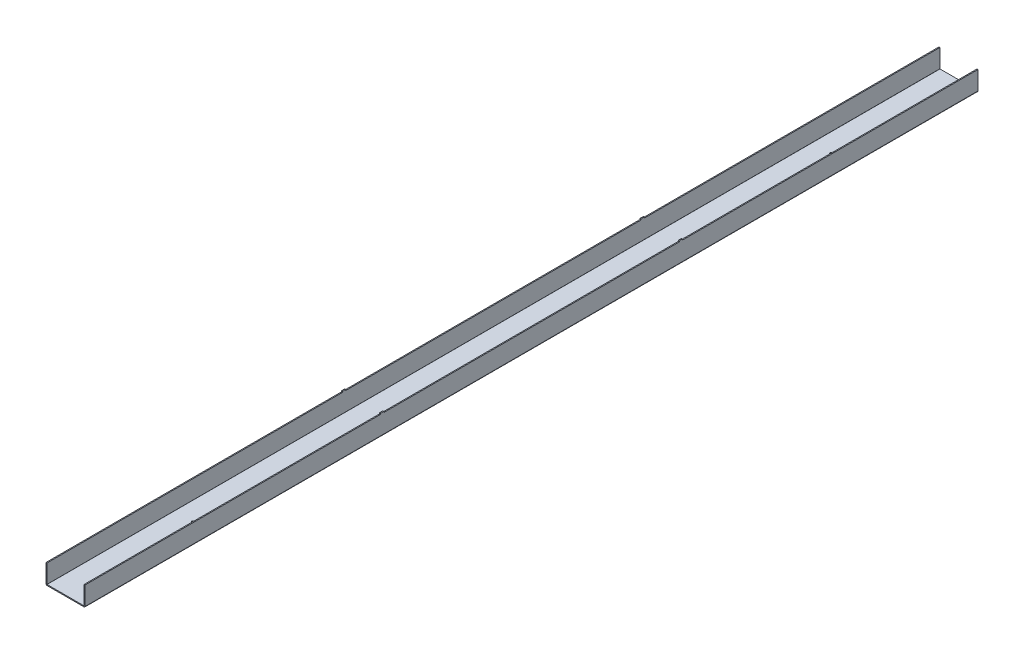
ISO-10303-21;
HEADER;
FILE_DESCRIPTION(('STEP AP214'),'2;1');
FILE_NAME('part.step','',(''),(''),'','','');
FILE_SCHEMA(('AUTOMOTIVE_DESIGN { 1 0 10303 214 1 1 1 1 }'));
ENDSEC;
DATA;
#1=APPLICATION_CONTEXT('core data for automotive mechanical design processes');
#2=APPLICATION_PROTOCOL_DEFINITION('international standard','automotive_design',2000,#1);
#3=PRODUCT_CONTEXT('',#1,'mechanical');
#4=PRODUCT('Part','Part','',(#3));
#5=PRODUCT_RELATED_PRODUCT_CATEGORY('part','',(#4));
#6=PRODUCT_DEFINITION_FORMATION('','',#4);
#7=PRODUCT_DEFINITION_CONTEXT('part definition',#1,'design');
#8=PRODUCT_DEFINITION('design','',#6,#7);
#9=PRODUCT_DEFINITION_SHAPE('','',#8);
#10=(LENGTH_UNIT() NAMED_UNIT(*) SI_UNIT(.MILLI.,.METRE.));
#11=(NAMED_UNIT(*) PLANE_ANGLE_UNIT() SI_UNIT($,.RADIAN.));
#12=(NAMED_UNIT(*) SI_UNIT($,.STERADIAN.) SOLID_ANGLE_UNIT());
#13=UNCERTAINTY_MEASURE_WITH_UNIT(LENGTH_MEASURE(1.E-05),#10,'distance_accuracy_value','');
#14=(GEOMETRIC_REPRESENTATION_CONTEXT(3) GLOBAL_UNCERTAINTY_ASSIGNED_CONTEXT((#13)) GLOBAL_UNIT_ASSIGNED_CONTEXT((#10,
#11,#12)) REPRESENTATION_CONTEXT('',''));
#15=CARTESIAN_POINT('',(0.,0.,0.));
#16=DIRECTION('',(0.,0.,1.));
#17=DIRECTION('',(1.,0.,0.));
#18=AXIS2_PLACEMENT_3D('',#15,#16,#17);
#19=CARTESIAN_POINT('',(2182.65200854939,1098.49999999999,-231.833333333333));
#20=DIRECTION('',(0.,0.,-1.));
#21=DIRECTION('',(0.,1.,0.));
#22=AXIS2_PLACEMENT_3D('',#19,#20,#21);
#23=PLANE('',#22);
#24=DIRECTION('',(0.,-1.,0.));
#25=VECTOR('',#24,1.);
#26=CARTESIAN_POINT('',(-560.,1098.5,-231.833333333333));
#27=LINE('',#26,#25);
#28=CARTESIAN_POINT('',(-560.,1100.,-231.833333333333));
#29=VERTEX_POINT('',#28);
#30=CARTESIAN_POINT('',(-560.,1098.5,-231.833333333333));
#31=VERTEX_POINT('',#30);
#32=EDGE_CURVE('E170',#29,#31,#27,.T.);
#33=ORIENTED_EDGE('',*,*,#32,.F.);
#34=DIRECTION('',(-1.,0.,0.));
#35=VECTOR('',#34,1.);
#36=CARTESIAN_POINT('',(2182.65200854939,1099.99999999999,-231.833333333333));
#37=LINE('',#36,#35);
#38=CARTESIAN_POINT('',(-558.5,1100.,-231.833333333333));
#39=VERTEX_POINT('',#38);
#40=EDGE_CURVE('E520',#39,#29,#37,.T.);
#41=ORIENTED_EDGE('',*,*,#40,.F.);
#42=DIRECTION('',(0.,-1.,0.));
#43=VECTOR('',#42,1.);
#44=CARTESIAN_POINT('',(-558.5,1098.5,-231.833333333333));
#45=LINE('',#44,#43);
#46=CARTESIAN_POINT('',(-558.5,1098.5,-231.833333333333));
#47=VERTEX_POINT('',#46);
#48=EDGE_CURVE('E530',#39,#47,#45,.T.);
#49=ORIENTED_EDGE('',*,*,#48,.T.);
#50=DIRECTION('',(-1.,0.,0.));
#51=VECTOR('',#50,1.);
#52=CARTESIAN_POINT('',(2182.65200854939,1098.49999999999,-231.833333333333));
#53=LINE('',#52,#51);
#54=EDGE_CURVE('E528',#47,#31,#53,.T.);
#55=ORIENTED_EDGE('',*,*,#54,.T.);
#56=EDGE_LOOP('',(#33,#41,#49,#55));
#57=FACE_BOUND('',#56,.T.);
#58=ADVANCED_FACE('F53',(#57),#23,.T.);
#59=CARTESIAN_POINT('',(2182.65200854939,1099.99999999999,-226.833333333333));
#60=DIRECTION('',(0.,1.,0.));
#61=DIRECTION('',(-1.,0.,0.));
#62=AXIS2_PLACEMENT_3D('',#59,#60,#61);
#63=PLANE('',#62);
#64=DIRECTION('',(0.,0.,-1.));
#65=VECTOR('',#64,1.);
#66=CARTESIAN_POINT('',(-560.,1100.,-226.833333333333));
#67=LINE('',#66,#65);
#68=CARTESIAN_POINT('',(-560.,1100.,-226.833333333333));
#69=VERTEX_POINT('',#68);
#70=EDGE_CURVE('E159',#69,#29,#67,.T.);
#71=ORIENTED_EDGE('',*,*,#70,.F.);
#72=DIRECTION('',(-1.,0.,0.));
#73=VECTOR('',#72,1.);
#74=CARTESIAN_POINT('',(2182.65200854939,1099.99999999999,-226.833333333333));
#75=LINE('',#74,#73);
#76=CARTESIAN_POINT('',(-558.5,1100.,-226.833333333333));
#77=VERTEX_POINT('',#76);
#78=EDGE_CURVE('E513',#77,#69,#75,.T.);
#79=ORIENTED_EDGE('',*,*,#78,.F.);
#80=DIRECTION('',(0.,0.,-1.));
#81=VECTOR('',#80,1.);
#82=CARTESIAN_POINT('',(-558.5,1100.,-226.833333333333));
#83=LINE('',#82,#81);
#84=EDGE_CURVE('E523',#77,#39,#83,.T.);
#85=ORIENTED_EDGE('',*,*,#84,.T.);
#86=ORIENTED_EDGE('',*,*,#40,.T.);
#87=EDGE_LOOP('',(#71,#79,#85,#86));
#88=FACE_BOUND('',#87,.T.);
#89=ADVANCED_FACE('F684',(#88),#63,.T.);
#90=CARTESIAN_POINT('',(2182.65200854939,1098.49999999999,-226.833333333333));
#91=DIRECTION('',(0.,0.,1.));
#92=DIRECTION('',(0.,-1.,0.));
#93=AXIS2_PLACEMENT_3D('',#90,#91,#92);
#94=PLANE('',#93);
#95=DIRECTION('',(0.,1.,0.));
#96=VECTOR('',#95,1.);
#97=CARTESIAN_POINT('',(-560.,1098.5,-226.833333333333));
#98=LINE('',#97,#96);
#99=CARTESIAN_POINT('',(-560.,1098.5,-226.833333333333));
#100=VERTEX_POINT('',#99);
#101=EDGE_CURVE('E616',#100,#69,#98,.T.);
#102=ORIENTED_EDGE('',*,*,#101,.F.);
#103=DIRECTION('',(-1.,0.,0.));
#104=VECTOR('',#103,1.);
#105=CARTESIAN_POINT('',(2182.65200854939,1098.49999999999,-226.833333333333));
#106=LINE('',#105,#104);
#107=CARTESIAN_POINT('',(-558.5,1098.5,-226.833333333333));
#108=VERTEX_POINT('',#107);
#109=EDGE_CURVE('E509',#108,#100,#106,.T.);
#110=ORIENTED_EDGE('',*,*,#109,.F.);
#111=DIRECTION('',(0.,1.,0.));
#112=VECTOR('',#111,1.);
#113=CARTESIAN_POINT('',(-558.5,1098.5,-226.833333333333));
#114=LINE('',#113,#112);
#115=EDGE_CURVE('E515',#108,#77,#114,.T.);
#116=ORIENTED_EDGE('',*,*,#115,.T.);
#117=ORIENTED_EDGE('',*,*,#78,.T.);
#118=EDGE_LOOP('',(#102,#110,#116,#117));
#119=FACE_BOUND('',#118,.T.);
#120=ADVANCED_FACE('F683',(#119),#94,.T.);
#121=CARTESIAN_POINT('',(2182.65200854939,1098.49999999999,685.5));
#122=DIRECTION('',(0.,-1.,0.));
#123=DIRECTION('',(1.,0.,0.));
#124=AXIS2_PLACEMENT_3D('',#121,#122,#123);
#125=PLANE('',#124);
#126=ORIENTED_EDGE('',*,*,#109,.T.);
#127=DIRECTION('',(0.,0.,1.));
#128=VECTOR('',#127,1.);
#129=CARTESIAN_POINT('',(-560.,1098.5,685.5));
#130=LINE('',#129,#128);
#131=CARTESIAN_POINT('',(-560.,1098.5,226.833333333333));
#132=VERTEX_POINT('',#131);
#133=EDGE_CURVE('E389',#100,#132,#130,.T.);
#134=ORIENTED_EDGE('',*,*,#133,.T.);
#135=DIRECTION('',(-1.,0.,0.));
#136=VECTOR('',#135,1.);
#137=CARTESIAN_POINT('',(2182.65200854939,1098.49999999999,226.833333333333));
#138=LINE('',#137,#136);
#139=CARTESIAN_POINT('',(-558.5,1098.5,226.833333333333));
#140=VERTEX_POINT('',#139);
#141=EDGE_CURVE('E508',#140,#132,#138,.T.);
#142=ORIENTED_EDGE('',*,*,#141,.F.);
#143=DIRECTION('',(0.,0.,1.));
#144=VECTOR('',#143,1.);
#145=CARTESIAN_POINT('',(-558.5,1098.5,685.5));
#146=LINE('',#145,#144);
#147=EDGE_CURVE('E66',#108,#140,#146,.T.);
#148=ORIENTED_EDGE('',*,*,#147,.F.);
#149=EDGE_LOOP('',(#126,#134,#142,#148));
#150=FACE_BOUND('',#149,.T.);
#151=ADVANCED_FACE('F671',(#150),#125,.F.);
#152=CARTESIAN_POINT('',(2182.65200854939,1098.49999999999,226.833333333333));
#153=DIRECTION('',(0.,0.,-1.));
#154=DIRECTION('',(0.,1.,0.));
#155=AXIS2_PLACEMENT_3D('',#152,#153,#154);
#156=PLANE('',#155);
#157=DIRECTION('',(0.,-1.,0.));
#158=VECTOR('',#157,1.);
#159=CARTESIAN_POINT('',(-560.,1098.5,226.833333333333));
#160=LINE('',#159,#158);
#161=CARTESIAN_POINT('',(-560.,1100.,226.833333333333));
#162=VERTEX_POINT('',#161);
#163=EDGE_CURVE('E620',#162,#132,#160,.T.);
#164=ORIENTED_EDGE('',*,*,#163,.F.);
#165=DIRECTION('',(-1.,0.,0.));
#166=VECTOR('',#165,1.);
#167=CARTESIAN_POINT('',(2182.65200854939,1099.99999999999,226.833333333333));
#168=LINE('',#167,#166);
#169=CARTESIAN_POINT('',(-558.5,1100.,226.833333333333));
#170=VERTEX_POINT('',#169);
#171=EDGE_CURVE('E637',#170,#162,#168,.T.);
#172=ORIENTED_EDGE('',*,*,#171,.F.);
#173=DIRECTION('',(0.,-1.,0.));
#174=VECTOR('',#173,1.);
#175=CARTESIAN_POINT('',(-558.5,1098.5,226.833333333333));
#176=LINE('',#175,#174);
#177=EDGE_CURVE('E502',#170,#140,#176,.T.);
#178=ORIENTED_EDGE('',*,*,#177,.T.);
#179=ORIENTED_EDGE('',*,*,#141,.T.);
#180=EDGE_LOOP('',(#164,#172,#178,#179));
#181=FACE_BOUND('',#180,.T.);
#182=ADVANCED_FACE('F675',(#181),#156,.T.);
#183=CARTESIAN_POINT('',(2182.65200854939,1099.99999999999,231.833333333333));
#184=DIRECTION('',(0.,1.,0.));
#185=DIRECTION('',(-1.,0.,0.));
#186=AXIS2_PLACEMENT_3D('',#183,#184,#185);
#187=PLANE('',#186);
#188=DIRECTION('',(0.,0.,-1.));
#189=VECTOR('',#188,1.);
#190=CARTESIAN_POINT('',(-560.,1100.,231.833333333333));
#191=LINE('',#190,#189);
#192=CARTESIAN_POINT('',(-560.,1100.,231.833333333333));
#193=VERTEX_POINT('',#192);
#194=EDGE_CURVE('E407',#193,#162,#191,.T.);
#195=ORIENTED_EDGE('',*,*,#194,.F.);
#196=DIRECTION('',(-1.,0.,0.));
#197=VECTOR('',#196,1.);
#198=CARTESIAN_POINT('',(2182.65200854939,1099.99999999999,231.833333333333));
#199=LINE('',#198,#197);
#200=CARTESIAN_POINT('',(-558.5,1100.,231.833333333333));
#201=VERTEX_POINT('',#200);
#202=EDGE_CURVE('E635',#201,#193,#199,.T.);
#203=ORIENTED_EDGE('',*,*,#202,.F.);
#204=DIRECTION('',(0.,0.,-1.));
#205=VECTOR('',#204,1.);
#206=CARTESIAN_POINT('',(-558.5,1100.,231.833333333333));
#207=LINE('',#206,#205);
#208=EDGE_CURVE('E677',#201,#170,#207,.T.);
#209=ORIENTED_EDGE('',*,*,#208,.T.);
#210=ORIENTED_EDGE('',*,*,#171,.T.);
#211=EDGE_LOOP('',(#195,#203,#209,#210));
#212=FACE_BOUND('',#211,.T.);
#213=ADVANCED_FACE('F633',(#212),#187,.T.);
#214=CARTESIAN_POINT('',(2182.65200854939,1098.49999999999,231.833333333333));
#215=DIRECTION('',(0.,0.,1.));
#216=DIRECTION('',(0.,-1.,0.));
#217=AXIS2_PLACEMENT_3D('',#214,#215,#216);
#218=PLANE('',#217);
#219=DIRECTION('',(0.,1.,0.));
#220=VECTOR('',#219,1.);
#221=CARTESIAN_POINT('',(-560.,1098.5,231.833333333333));
#222=LINE('',#221,#220);
#223=CARTESIAN_POINT('',(-560.,1098.5,231.833333333333));
#224=VERTEX_POINT('',#223);
#225=EDGE_CURVE('E355',#224,#193,#222,.T.);
#226=ORIENTED_EDGE('',*,*,#225,.F.);
#227=DIRECTION('',(-1.,0.,0.));
#228=VECTOR('',#227,1.);
#229=CARTESIAN_POINT('',(2182.65200854939,1098.49999999999,231.833333333333));
#230=LINE('',#229,#228);
#231=CARTESIAN_POINT('',(-558.5,1098.5,231.833333333333));
#232=VERTEX_POINT('',#231);
#233=EDGE_CURVE('E645',#232,#224,#230,.T.);
#234=ORIENTED_EDGE('',*,*,#233,.F.);
#235=DIRECTION('',(0.,1.,0.));
#236=VECTOR('',#235,1.);
#237=CARTESIAN_POINT('',(-558.5,1098.5,231.833333333333));
#238=LINE('',#237,#236);
#239=EDGE_CURVE('E643',#232,#201,#238,.T.);
#240=ORIENTED_EDGE('',*,*,#239,.T.);
#241=ORIENTED_EDGE('',*,*,#202,.T.);
#242=EDGE_LOOP('',(#226,#234,#240,#241));
#243=FACE_BOUND('',#242,.T.);
#244=ADVANCED_FACE('F640',(#243),#218,.T.);
#245=ORIENTED_EDGE('',*,*,#233,.T.);
#246=CARTESIAN_POINT('',(-560.,1098.5,685.5));
#247=VERTEX_POINT('',#246);
#248=EDGE_CURVE('E390',#224,#247,#130,.T.);
#249=ORIENTED_EDGE('',*,*,#248,.T.);
#250=DIRECTION('',(-1.,0.,0.));
#251=VECTOR('',#250,1.);
#252=CARTESIAN_POINT('',(2182.65200854939,1098.49999999999,685.5));
#253=LINE('',#252,#251);
#254=CARTESIAN_POINT('',(-558.5,1098.5,685.5));
#255=VERTEX_POINT('',#254);
#256=EDGE_CURVE('E487',#255,#247,#253,.T.);
#257=ORIENTED_EDGE('',*,*,#256,.F.);
#258=EDGE_CURVE('E12',#232,#255,#146,.T.);
#259=ORIENTED_EDGE('',*,*,#258,.F.);
#260=EDGE_LOOP('',(#245,#249,#257,#259));
#261=FACE_BOUND('',#260,.T.);
#262=ADVANCED_FACE('F690',(#261),#125,.F.);
#263=DIRECTION('',(-1.,0.,0.));
#264=VECTOR('',#263,1.);
#265=CARTESIAN_POINT('',(2182.65200854939,1098.49999999999,-685.5));
#266=LINE('',#265,#264);
#267=CARTESIAN_POINT('',(-558.5,1098.5,-685.5));
#268=VERTEX_POINT('',#267);
#269=CARTESIAN_POINT('',(-560.,1098.5,-685.5));
#270=VERTEX_POINT('',#269);
#271=EDGE_CURVE('E387',#268,#270,#266,.T.);
#272=ORIENTED_EDGE('',*,*,#271,.T.);
#273=EDGE_CURVE('E378',#270,#31,#130,.T.);
#274=ORIENTED_EDGE('',*,*,#273,.T.);
#275=ORIENTED_EDGE('',*,*,#54,.F.);
#276=EDGE_CURVE('E68',#268,#47,#146,.T.);
#277=ORIENTED_EDGE('',*,*,#276,.F.);
#278=EDGE_LOOP('',(#272,#274,#275,#277));
#279=FACE_BOUND('',#278,.T.);
#280=ADVANCED_FACE('F688',(#279),#125,.F.);
#281=CARTESIAN_POINT('',(2182.65200854939,1070.73659999999,-685.5));
#282=DIRECTION('',(0.,0.,-1.));
#283=DIRECTION('',(0.,1.,0.));
#284=AXIS2_PLACEMENT_3D('',#281,#282,#283);
#285=PLANE('',#284);
#286=DIRECTION('',(0.,1.,0.));
#287=VECTOR('',#286,1.);
#288=CARTESIAN_POINT('',(-560.,1070.7366,-685.5));
#289=LINE('',#288,#287);
#290=CARTESIAN_POINT('',(-560.,1070.1,-685.5));
#291=VERTEX_POINT('',#290);
#292=EDGE_CURVE('E370',#291,#270,#289,.T.);
#293=ORIENTED_EDGE('',*,*,#292,.T.);
#294=ORIENTED_EDGE('',*,*,#271,.F.);
#295=DIRECTION('',(0.,1.,0.));
#296=VECTOR('',#295,1.);
#297=CARTESIAN_POINT('',(-558.5,1070.7366,-685.5));
#298=LINE('',#297,#296);
#299=CARTESIAN_POINT('',(-558.5,1070.1,-685.5));
#300=VERTEX_POINT('',#299);
#301=EDGE_CURVE('E372',#268,#300,#298,.F.);
#302=ORIENTED_EDGE('',*,*,#301,.T.);
#303=DIRECTION('',(-1.,0.,0.));
#304=VECTOR('',#303,1.);
#305=CARTESIAN_POINT('',(2182.65200854939,1070.09999999999,-685.5));
#306=LINE('',#305,#304);
#307=EDGE_CURVE('E356',#300,#291,#306,.T.);
#308=ORIENTED_EDGE('',*,*,#307,.T.);
#309=EDGE_LOOP('',(#293,#294,#302,#308));
#310=FACE_BOUND('',#309,.T.);
#311=ADVANCED_FACE('F368',(#310),#285,.T.);
#312=CARTESIAN_POINT('',(-560.,1098.5,685.5));
#313=DIRECTION('',(1.,0.,0.));
#314=DIRECTION('',(0.,1.,0.));
#315=AXIS2_PLACEMENT_3D('',#312,#313,#314);
#316=PLANE('',#315);
#317=ORIENTED_EDGE('',*,*,#292,.F.);
#318=DIRECTION('',(0.,0.,1.));
#319=VECTOR('',#318,1.);
#320=CARTESIAN_POINT('',(-560.,1070.1,-685.5));
#321=LINE('',#320,#319);
#322=CARTESIAN_POINT('',(-560.,1070.1,685.5));
#323=VERTEX_POINT('',#322);
#324=EDGE_CURVE('E342',#291,#323,#321,.T.);
#325=ORIENTED_EDGE('',*,*,#324,.T.);
#326=DIRECTION('',(0.,1.,0.));
#327=VECTOR('',#326,1.);
#328=CARTESIAN_POINT('',(-560.,1070.7366,685.5));
#329=LINE('',#328,#327);
#330=EDGE_CURVE('E612',#247,#323,#329,.F.);
#331=ORIENTED_EDGE('',*,*,#330,.F.);
#332=ORIENTED_EDGE('',*,*,#248,.F.);
#333=ORIENTED_EDGE('',*,*,#225,.T.);
#334=ORIENTED_EDGE('',*,*,#194,.T.);
#335=ORIENTED_EDGE('',*,*,#163,.T.);
#336=ORIENTED_EDGE('',*,*,#133,.F.);
#337=ORIENTED_EDGE('',*,*,#101,.T.);
#338=ORIENTED_EDGE('',*,*,#70,.T.);
#339=ORIENTED_EDGE('',*,*,#32,.T.);
#340=ORIENTED_EDGE('',*,*,#273,.F.);
#341=EDGE_LOOP('',(#317,#325,#331,#332,#333,#334,#335,#336,#337,#338,#339,#340));
#342=FACE_BOUND('',#341,.T.);
#343=ADVANCED_FACE('F377',(#342),#316,.F.);
#344=CARTESIAN_POINT('',(2182.65200854939,1070.73659999999,685.5));
#345=DIRECTION('',(0.,0.,1.));
#346=DIRECTION('',(0.,-1.,0.));
#347=AXIS2_PLACEMENT_3D('',#344,#345,#346);
#348=PLANE('',#347);
#349=ORIENTED_EDGE('',*,*,#330,.T.);
#350=DIRECTION('',(-1.,0.,0.));
#351=VECTOR('',#350,1.);
#352=CARTESIAN_POINT('',(2182.65200854939,1070.09999999999,685.5));
#353=LINE('',#352,#351);
#354=CARTESIAN_POINT('',(-558.5,1070.1,685.5));
#355=VERTEX_POINT('',#354);
#356=EDGE_CURVE('E534',#355,#323,#353,.T.);
#357=ORIENTED_EDGE('',*,*,#356,.F.);
#358=DIRECTION('',(0.,1.,0.));
#359=VECTOR('',#358,1.);
#360=CARTESIAN_POINT('',(-558.5,1070.7366,685.5));
#361=LINE('',#360,#359);
#362=EDGE_CURVE('E655',#355,#255,#361,.T.);
#363=ORIENTED_EDGE('',*,*,#362,.T.);
#364=ORIENTED_EDGE('',*,*,#256,.T.);
#365=EDGE_LOOP('',(#349,#357,#363,#364));
#366=FACE_BOUND('',#365,.T.);
#367=ADVANCED_FACE('F662',(#366),#348,.T.);
#368=CARTESIAN_POINT('',(-558.5,1098.5,685.5));
#369=DIRECTION('',(1.,0.,0.));
#370=DIRECTION('',(0.,1.,0.));
#371=AXIS2_PLACEMENT_3D('',#368,#369,#370);
#372=PLANE('',#371);
#373=DIRECTION('',(0.,0.,1.));
#374=VECTOR('',#373,1.);
#375=CARTESIAN_POINT('',(-558.5,1070.1,-685.5));
#376=LINE('',#375,#374);
#377=EDGE_CURVE('E58',#300,#355,#376,.T.);
#378=ORIENTED_EDGE('',*,*,#377,.F.);
#379=ORIENTED_EDGE('',*,*,#301,.F.);
#380=ORIENTED_EDGE('',*,*,#276,.T.);
#381=ORIENTED_EDGE('',*,*,#48,.F.);
#382=ORIENTED_EDGE('',*,*,#84,.F.);
#383=ORIENTED_EDGE('',*,*,#115,.F.);
#384=ORIENTED_EDGE('',*,*,#147,.T.);
#385=ORIENTED_EDGE('',*,*,#177,.F.);
#386=ORIENTED_EDGE('',*,*,#208,.F.);
#387=ORIENTED_EDGE('',*,*,#239,.F.);
#388=ORIENTED_EDGE('',*,*,#258,.T.);
#389=ORIENTED_EDGE('',*,*,#362,.F.);
#390=EDGE_LOOP('',(#378,#379,#380,#381,#382,#383,#384,#385,#386,#387,#388,#389));
#391=FACE_BOUND('',#390,.T.);
#392=ADVANCED_FACE('F56',(#391),#372,.T.);
#393=CARTESIAN_POINT('',(-3242.65200854939,1098.5,231.833333333333));
#394=DIRECTION('',(0.,0.,1.));
#395=DIRECTION('',(0.,1.,0.));
#396=AXIS2_PLACEMENT_3D('',#393,#394,#395);
#397=PLANE('',#396);
#398=DIRECTION('',(0.,-1.,0.));
#399=VECTOR('',#398,1.);
#400=CARTESIAN_POINT('',(-500.,1098.5,231.833333333333));
#401=LINE('',#400,#399);
#402=CARTESIAN_POINT('',(-500.,1100.,231.833333333333));
#403=VERTEX_POINT('',#402);
#404=CARTESIAN_POINT('',(-500.,1098.5,231.833333333333));
#405=VERTEX_POINT('',#404);
#406=EDGE_CURVE('E271',#403,#405,#401,.T.);
#407=ORIENTED_EDGE('',*,*,#406,.F.);
#408=DIRECTION('',(1.,0.,0.));
#409=VECTOR('',#408,1.);
#410=CARTESIAN_POINT('',(-3242.65200854939,1100.,231.833333333333));
#411=LINE('',#410,#409);
#412=CARTESIAN_POINT('',(-501.5,1100.,231.833333333333));
#413=VERTEX_POINT('',#412);
#414=EDGE_CURVE('E588',#413,#403,#411,.T.);
#415=ORIENTED_EDGE('',*,*,#414,.F.);
#416=DIRECTION('',(0.,-1.,0.));
#417=VECTOR('',#416,1.);
#418=CARTESIAN_POINT('',(-501.5,1098.5,231.833333333333));
#419=LINE('',#418,#417);
#420=CARTESIAN_POINT('',(-501.5,1098.5,231.833333333333));
#421=VERTEX_POINT('',#420);
#422=EDGE_CURVE('E598',#413,#421,#419,.T.);
#423=ORIENTED_EDGE('',*,*,#422,.T.);
#424=DIRECTION('',(1.,0.,0.));
#425=VECTOR('',#424,1.);
#426=CARTESIAN_POINT('',(-3242.65200854939,1098.5,231.833333333333));
#427=LINE('',#426,#425);
#428=EDGE_CURVE('E595',#421,#405,#427,.T.);
#429=ORIENTED_EDGE('',*,*,#428,.T.);
#430=EDGE_LOOP('',(#407,#415,#423,#429));
#431=FACE_BOUND('',#430,.T.);
#432=ADVANCED_FACE('F776',(#431),#397,.T.);
#433=CARTESIAN_POINT('',(-3242.65200854939,1100.,226.833333333333));
#434=DIRECTION('',(0.,1.,0.));
#435=DIRECTION('',(-1.,0.,0.));
#436=AXIS2_PLACEMENT_3D('',#433,#434,#435);
#437=PLANE('',#436);
#438=DIRECTION('',(0.,0.,1.));
#439=VECTOR('',#438,1.);
#440=CARTESIAN_POINT('',(-500.,1100.,226.833333333333));
#441=LINE('',#440,#439);
#442=CARTESIAN_POINT('',(-500.,1100.,226.833333333333));
#443=VERTEX_POINT('',#442);
#444=EDGE_CURVE('E263',#443,#403,#441,.T.);
#445=ORIENTED_EDGE('',*,*,#444,.F.);
#446=DIRECTION('',(1.,0.,0.));
#447=VECTOR('',#446,1.);
#448=CARTESIAN_POINT('',(-3242.65200854939,1100.,226.833333333333));
#449=LINE('',#448,#447);
#450=CARTESIAN_POINT('',(-501.5,1100.,226.833333333333));
#451=VERTEX_POINT('',#450);
#452=EDGE_CURVE('E587',#451,#443,#449,.T.);
#453=ORIENTED_EDGE('',*,*,#452,.F.);
#454=DIRECTION('',(0.,0.,1.));
#455=VECTOR('',#454,1.);
#456=CARTESIAN_POINT('',(-501.5,1100.,226.833333333333));
#457=LINE('',#456,#455);
#458=EDGE_CURVE('E590',#451,#413,#457,.T.);
#459=ORIENTED_EDGE('',*,*,#458,.T.);
#460=ORIENTED_EDGE('',*,*,#414,.T.);
#461=EDGE_LOOP('',(#445,#453,#459,#460));
#462=FACE_BOUND('',#461,.T.);
#463=ADVANCED_FACE('F784',(#462),#437,.T.);
#464=CARTESIAN_POINT('',(-3242.65200854939,1098.5,226.833333333333));
#465=DIRECTION('',(0.,0.,-1.));
#466=DIRECTION('',(0.,-1.,0.));
#467=AXIS2_PLACEMENT_3D('',#464,#465,#466);
#468=PLANE('',#467);
#469=DIRECTION('',(0.,1.,0.));
#470=VECTOR('',#469,1.);
#471=CARTESIAN_POINT('',(-500.,1098.5,226.833333333333));
#472=LINE('',#471,#470);
#473=CARTESIAN_POINT('',(-500.,1098.5,226.833333333333));
#474=VERTEX_POINT('',#473);
#475=EDGE_CURVE('E1235',#474,#443,#472,.T.);
#476=ORIENTED_EDGE('',*,*,#475,.F.);
#477=DIRECTION('',(1.,0.,0.));
#478=VECTOR('',#477,1.);
#479=CARTESIAN_POINT('',(-3242.65200854939,1098.5,226.833333333333));
#480=LINE('',#479,#478);
#481=CARTESIAN_POINT('',(-501.5,1098.5,226.833333333333));
#482=VERTEX_POINT('',#481);
#483=EDGE_CURVE('E576',#482,#474,#480,.T.);
#484=ORIENTED_EDGE('',*,*,#483,.F.);
#485=DIRECTION('',(0.,1.,0.));
#486=VECTOR('',#485,1.);
#487=CARTESIAN_POINT('',(-501.5,1098.5,226.833333333333));
#488=LINE('',#487,#486);
#489=EDGE_CURVE('E549',#482,#451,#488,.T.);
#490=ORIENTED_EDGE('',*,*,#489,.T.);
#491=ORIENTED_EDGE('',*,*,#452,.T.);
#492=EDGE_LOOP('',(#476,#484,#490,#491));
#493=FACE_BOUND('',#492,.T.);
#494=ADVANCED_FACE('F793',(#493),#468,.T.);
#495=CARTESIAN_POINT('',(-3242.65200854939,1098.5,685.5));
#496=DIRECTION('',(0.,-1.,0.));
#497=DIRECTION('',(1.,0.,0.));
#498=AXIS2_PLACEMENT_3D('',#495,#496,#497);
#499=PLANE('',#498);
#500=ORIENTED_EDGE('',*,*,#483,.T.);
#501=DIRECTION('',(0.,0.,1.));
#502=VECTOR('',#501,1.);
#503=CARTESIAN_POINT('',(-500.,1098.5,685.5));
#504=LINE('',#503,#502);
#505=CARTESIAN_POINT('',(-500.,1098.5,-226.833333333333));
#506=VERTEX_POINT('',#505);
#507=EDGE_CURVE('E563',#474,#506,#504,.F.);
#508=ORIENTED_EDGE('',*,*,#507,.T.);
#509=DIRECTION('',(1.,0.,0.));
#510=VECTOR('',#509,1.);
#511=CARTESIAN_POINT('',(-3242.65200854939,1098.5,-226.833333333333));
#512=LINE('',#511,#510);
#513=CARTESIAN_POINT('',(-501.5,1098.5,-226.833333333333));
#514=VERTEX_POINT('',#513);
#515=EDGE_CURVE('E558',#514,#506,#512,.T.);
#516=ORIENTED_EDGE('',*,*,#515,.F.);
#517=DIRECTION('',(0.,0.,1.));
#518=VECTOR('',#517,1.);
#519=CARTESIAN_POINT('',(-501.5,1098.5,685.5));
#520=LINE('',#519,#518);
#521=EDGE_CURVE('E467',#482,#514,#520,.F.);
#522=ORIENTED_EDGE('',*,*,#521,.F.);
#523=EDGE_LOOP('',(#500,#508,#516,#522));
#524=FACE_BOUND('',#523,.T.);
#525=ADVANCED_FACE('F565',(#524),#499,.F.);
#526=CARTESIAN_POINT('',(-3242.65200854939,1098.5,-226.833333333333));
#527=DIRECTION('',(0.,0.,1.));
#528=DIRECTION('',(0.,1.,0.));
#529=AXIS2_PLACEMENT_3D('',#526,#527,#528);
#530=PLANE('',#529);
#531=DIRECTION('',(0.,-1.,0.));
#532=VECTOR('',#531,1.);
#533=CARTESIAN_POINT('',(-500.,1098.5,-226.833333333333));
#534=LINE('',#533,#532);
#535=CARTESIAN_POINT('',(-500.,1100.,-226.833333333333));
#536=VERTEX_POINT('',#535);
#537=EDGE_CURVE('E1230',#536,#506,#534,.T.);
#538=ORIENTED_EDGE('',*,*,#537,.F.);
#539=DIRECTION('',(1.,0.,0.));
#540=VECTOR('',#539,1.);
#541=CARTESIAN_POINT('',(-3242.65200854939,1100.,-226.833333333333));
#542=LINE('',#541,#540);
#543=CARTESIAN_POINT('',(-501.5,1100.,-226.833333333333));
#544=VERTEX_POINT('',#543);
#545=EDGE_CURVE('E561',#544,#536,#542,.T.);
#546=ORIENTED_EDGE('',*,*,#545,.F.);
#547=DIRECTION('',(0.,-1.,0.));
#548=VECTOR('',#547,1.);
#549=CARTESIAN_POINT('',(-501.5,1098.5,-226.833333333333));
#550=LINE('',#549,#548);
#551=EDGE_CURVE('E546',#544,#514,#550,.T.);
#552=ORIENTED_EDGE('',*,*,#551,.T.);
#553=ORIENTED_EDGE('',*,*,#515,.T.);
#554=EDGE_LOOP('',(#538,#546,#552,#553));
#555=FACE_BOUND('',#554,.T.);
#556=ADVANCED_FACE('F557',(#555),#530,.T.);
#557=CARTESIAN_POINT('',(-3242.65200854939,1100.,-231.833333333333));
#558=DIRECTION('',(0.,1.,0.));
#559=DIRECTION('',(-1.,0.,0.));
#560=AXIS2_PLACEMENT_3D('',#557,#558,#559);
#561=PLANE('',#560);
#562=DIRECTION('',(0.,0.,1.));
#563=VECTOR('',#562,1.);
#564=CARTESIAN_POINT('',(-500.,1100.,-231.833333333333));
#565=LINE('',#564,#563);
#566=CARTESIAN_POINT('',(-500.,1100.,-231.833333333333));
#567=VERTEX_POINT('',#566);
#568=EDGE_CURVE('E1226',#567,#536,#565,.T.);
#569=ORIENTED_EDGE('',*,*,#568,.F.);
#570=DIRECTION('',(1.,0.,0.));
#571=VECTOR('',#570,1.);
#572=CARTESIAN_POINT('',(-3242.65200854939,1100.,-231.833333333333));
#573=LINE('',#572,#571);
#574=CARTESIAN_POINT('',(-501.5,1100.,-231.833333333333));
#575=VERTEX_POINT('',#574);
#576=EDGE_CURVE('E1216',#575,#567,#573,.T.);
#577=ORIENTED_EDGE('',*,*,#576,.F.);
#578=DIRECTION('',(0.,0.,1.));
#579=VECTOR('',#578,1.);
#580=CARTESIAN_POINT('',(-501.5,1100.,-231.833333333333));
#581=LINE('',#580,#579);
#582=EDGE_CURVE('E568',#575,#544,#581,.T.);
#583=ORIENTED_EDGE('',*,*,#582,.T.);
#584=ORIENTED_EDGE('',*,*,#545,.T.);
#585=EDGE_LOOP('',(#569,#577,#583,#584));
#586=FACE_BOUND('',#585,.T.);
#587=ADVANCED_FACE('F821',(#586),#561,.T.);
#588=CARTESIAN_POINT('',(-3242.65200854939,1098.5,-231.833333333333));
#589=DIRECTION('',(0.,0.,-1.));
#590=DIRECTION('',(0.,-1.,0.));
#591=AXIS2_PLACEMENT_3D('',#588,#589,#590);
#592=PLANE('',#591);
#593=DIRECTION('',(0.,1.,0.));
#594=VECTOR('',#593,1.);
#595=CARTESIAN_POINT('',(-500.,1098.5,-231.833333333333));
#596=LINE('',#595,#594);
#597=CARTESIAN_POINT('',(-500.,1098.5,-231.833333333333));
#598=VERTEX_POINT('',#597);
#599=EDGE_CURVE('E1190',#598,#567,#596,.T.);
#600=ORIENTED_EDGE('',*,*,#599,.F.);
#601=DIRECTION('',(1.,0.,0.));
#602=VECTOR('',#601,1.);
#603=CARTESIAN_POINT('',(-3242.65200854939,1098.5,-231.833333333333));
#604=LINE('',#603,#602);
#605=CARTESIAN_POINT('',(-501.5,1098.5,-231.833333333333));
#606=VERTEX_POINT('',#605);
#607=EDGE_CURVE('E1209',#606,#598,#604,.T.);
#608=ORIENTED_EDGE('',*,*,#607,.F.);
#609=DIRECTION('',(0.,1.,0.));
#610=VECTOR('',#609,1.);
#611=CARTESIAN_POINT('',(-501.5,1098.5,-231.833333333333));
#612=LINE('',#611,#610);
#613=EDGE_CURVE('E1219',#606,#575,#612,.T.);
#614=ORIENTED_EDGE('',*,*,#613,.T.);
#615=ORIENTED_EDGE('',*,*,#576,.T.);
#616=EDGE_LOOP('',(#600,#608,#614,#615));
#617=FACE_BOUND('',#616,.T.);
#618=ADVANCED_FACE('F830',(#617),#592,.T.);
#619=ORIENTED_EDGE('',*,*,#607,.T.);
#620=CARTESIAN_POINT('',(-500.,1098.5,-685.5));
#621=VERTEX_POINT('',#620);
#622=EDGE_CURVE('E1204',#598,#621,#504,.F.);
#623=ORIENTED_EDGE('',*,*,#622,.T.);
#624=DIRECTION('',(1.,0.,0.));
#625=VECTOR('',#624,1.);
#626=CARTESIAN_POINT('',(-3242.65200854939,1098.5,-685.5));
#627=LINE('',#626,#625);
#628=CARTESIAN_POINT('',(-501.5,1098.5,-685.5));
#629=VERTEX_POINT('',#628);
#630=EDGE_CURVE('E468',#629,#621,#627,.T.);
#631=ORIENTED_EDGE('',*,*,#630,.F.);
#632=EDGE_CURVE('E180',#606,#629,#520,.F.);
#633=ORIENTED_EDGE('',*,*,#632,.F.);
#634=EDGE_LOOP('',(#619,#623,#631,#633));
#635=FACE_BOUND('',#634,.T.);
#636=ADVANCED_FACE('F812',(#635),#499,.F.);
#637=DIRECTION('',(1.,0.,0.));
#638=VECTOR('',#637,1.);
#639=CARTESIAN_POINT('',(-3242.65200854939,1098.5,685.5));
#640=LINE('',#639,#638);
#641=CARTESIAN_POINT('',(-501.5,1098.5,685.5));
#642=VERTEX_POINT('',#641);
#643=CARTESIAN_POINT('',(-500.,1098.5,685.5));
#644=VERTEX_POINT('',#643);
#645=EDGE_CURVE('E1208',#642,#644,#640,.T.);
#646=ORIENTED_EDGE('',*,*,#645,.T.);
#647=EDGE_CURVE('E1203',#644,#405,#504,.F.);
#648=ORIENTED_EDGE('',*,*,#647,.T.);
#649=ORIENTED_EDGE('',*,*,#428,.F.);
#650=EDGE_CURVE('E464',#642,#421,#520,.F.);
#651=ORIENTED_EDGE('',*,*,#650,.F.);
#652=EDGE_LOOP('',(#646,#648,#649,#651));
#653=FACE_BOUND('',#652,.T.);
#654=ADVANCED_FACE('F813',(#653),#499,.F.);
#655=CARTESIAN_POINT('',(-3242.65200854939,1070.7366,685.5));
#656=DIRECTION('',(0.,0.,1.));
#657=DIRECTION('',(0.,1.,0.));
#658=AXIS2_PLACEMENT_3D('',#655,#656,#657);
#659=PLANE('',#658);
#660=DIRECTION('',(0.,1.,0.));
#661=VECTOR('',#660,1.);
#662=CARTESIAN_POINT('',(-500.,1070.7366,685.5));
#663=LINE('',#662,#661);
#664=CARTESIAN_POINT('',(-500.,1070.1,685.5));
#665=VERTEX_POINT('',#664);
#666=EDGE_CURVE('E1199',#665,#644,#663,.T.);
#667=ORIENTED_EDGE('',*,*,#666,.T.);
#668=ORIENTED_EDGE('',*,*,#645,.F.);
#669=DIRECTION('',(0.,1.,0.));
#670=VECTOR('',#669,1.);
#671=CARTESIAN_POINT('',(-501.5,1070.7366,685.5));
#672=LINE('',#671,#670);
#673=CARTESIAN_POINT('',(-501.5,1070.1,685.5));
#674=VERTEX_POINT('',#673);
#675=EDGE_CURVE('E1197',#642,#674,#672,.F.);
#676=ORIENTED_EDGE('',*,*,#675,.T.);
#677=DIRECTION('',(1.,0.,0.));
#678=VECTOR('',#677,1.);
#679=CARTESIAN_POINT('',(-3242.65200854939,1070.1,685.5));
#680=LINE('',#679,#678);
#681=EDGE_CURVE('E1191',#674,#665,#680,.T.);
#682=ORIENTED_EDGE('',*,*,#681,.T.);
#683=EDGE_LOOP('',(#667,#668,#676,#682));
#684=FACE_BOUND('',#683,.T.);
#685=ADVANCED_FACE('F857',(#684),#659,.T.);
#686=CARTESIAN_POINT('',(-500.,1068.5,685.5));
#687=DIRECTION('',(-1.,0.,0.));
#688=DIRECTION('',(0.,0.,1.));
#689=AXIS2_PLACEMENT_3D('',#686,#687,#688);
#690=PLANE('',#689);
#691=ORIENTED_EDGE('',*,*,#666,.F.);
#692=DIRECTION('',(0.,0.,-1.));
#693=VECTOR('',#692,1.);
#694=CARTESIAN_POINT('',(-500.,1070.1,685.5));
#695=LINE('',#694,#693);
#696=CARTESIAN_POINT('',(-500.,1070.1,-685.5));
#697=VERTEX_POINT('',#696);
#698=EDGE_CURVE('E1184',#665,#697,#695,.T.);
#699=ORIENTED_EDGE('',*,*,#698,.T.);
#700=DIRECTION('',(0.,1.,0.));
#701=VECTOR('',#700,1.);
#702=CARTESIAN_POINT('',(-500.,1070.7366,-685.5));
#703=LINE('',#702,#701);
#704=EDGE_CURVE('E475',#621,#697,#703,.F.);
#705=ORIENTED_EDGE('',*,*,#704,.F.);
#706=ORIENTED_EDGE('',*,*,#622,.F.);
#707=ORIENTED_EDGE('',*,*,#599,.T.);
#708=ORIENTED_EDGE('',*,*,#568,.T.);
#709=ORIENTED_EDGE('',*,*,#537,.T.);
#710=ORIENTED_EDGE('',*,*,#507,.F.);
#711=ORIENTED_EDGE('',*,*,#475,.T.);
#712=ORIENTED_EDGE('',*,*,#444,.T.);
#713=ORIENTED_EDGE('',*,*,#406,.T.);
#714=ORIENTED_EDGE('',*,*,#647,.F.);
#715=EDGE_LOOP('',(#691,#699,#705,#706,#707,#708,#709,#710,#711,#712,#713,#714));
#716=FACE_BOUND('',#715,.T.);
#717=ADVANCED_FACE('F866',(#716),#690,.F.);
#718=CARTESIAN_POINT('',(-3242.65200854939,1070.7366,-685.5));
#719=DIRECTION('',(0.,0.,-1.));
#720=DIRECTION('',(0.,-1.,0.));
#721=AXIS2_PLACEMENT_3D('',#718,#719,#720);
#722=PLANE('',#721);
#723=ORIENTED_EDGE('',*,*,#704,.T.);
#724=DIRECTION('',(1.,0.,0.));
#725=VECTOR('',#724,1.);
#726=CARTESIAN_POINT('',(-3242.65200854939,1070.1,-685.5));
#727=LINE('',#726,#725);
#728=CARTESIAN_POINT('',(-501.5,1070.1,-685.5));
#729=VERTEX_POINT('',#728);
#730=EDGE_CURVE('E602',#729,#697,#727,.T.);
#731=ORIENTED_EDGE('',*,*,#730,.F.);
#732=DIRECTION('',(0.,1.,0.));
#733=VECTOR('',#732,1.);
#734=CARTESIAN_POINT('',(-501.5,1070.7366,-685.5));
#735=LINE('',#734,#733);
#736=EDGE_CURVE('E471',#729,#629,#735,.T.);
#737=ORIENTED_EDGE('',*,*,#736,.T.);
#738=ORIENTED_EDGE('',*,*,#630,.T.);
#739=EDGE_LOOP('',(#723,#731,#737,#738));
#740=FACE_BOUND('',#739,.T.);
#741=ADVANCED_FACE('F877',(#740),#722,.T.);
#742=CARTESIAN_POINT('',(-501.5,1068.5,685.5));
#743=DIRECTION('',(-1.,0.,0.));
#744=DIRECTION('',(0.,0.,1.));
#745=AXIS2_PLACEMENT_3D('',#742,#743,#744);
#746=PLANE('',#745);
#747=DIRECTION('',(0.,0.,-1.));
#748=VECTOR('',#747,1.);
#749=CARTESIAN_POINT('',(-501.5,1070.1,685.5));
#750=LINE('',#749,#748);
#751=EDGE_CURVE('E463',#674,#729,#750,.T.);
#752=ORIENTED_EDGE('',*,*,#751,.F.);
#753=ORIENTED_EDGE('',*,*,#675,.F.);
#754=ORIENTED_EDGE('',*,*,#650,.T.);
#755=ORIENTED_EDGE('',*,*,#422,.F.);
#756=ORIENTED_EDGE('',*,*,#458,.F.);
#757=ORIENTED_EDGE('',*,*,#489,.F.);
#758=ORIENTED_EDGE('',*,*,#521,.T.);
#759=ORIENTED_EDGE('',*,*,#551,.F.);
#760=ORIENTED_EDGE('',*,*,#582,.F.);
#761=ORIENTED_EDGE('',*,*,#613,.F.);
#762=ORIENTED_EDGE('',*,*,#632,.T.);
#763=ORIENTED_EDGE('',*,*,#736,.F.);
#764=EDGE_LOOP('',(#752,#753,#754,#755,#756,#757,#758,#759,#760,#761,#762,#763));
#765=FACE_BOUND('',#764,.T.);
#766=ADVANCED_FACE('F545',(#765),#746,.T.);
#767=CARTESIAN_POINT('',(-529.999999999999,1068.5,490.));
#768=DIRECTION('',(0.,-1.,0.));
#769=DIRECTION('',(0.,0.,-1.));
#770=AXIS2_PLACEMENT_3D('',#767,#768,#769);
#771=CYLINDRICAL_SURFACE('',#770,1.65000000000004);
#772=CARTESIAN_POINT('',(-529.999999999999,1068.5,490.));
#773=DIRECTION('',(0.,-1.,0.));
#774=DIRECTION('',(0.,0.,-1.));
#775=AXIS2_PLACEMENT_3D('',#772,#773,#774);
#776=CIRCLE('',#775,1.65000000000004);
#777=CARTESIAN_POINT('',(-529.999999999999,1068.5,488.35));
#778=VERTEX_POINT('',#777);
#779=EDGE_CURVE('E1170',#778,#778,#776,.F.);
#780=ORIENTED_EDGE('',*,*,#779,.F.);
#781=EDGE_LOOP('',(#780));
#782=FACE_BOUND('',#781,.T.);
#783=CARTESIAN_POINT('',(-529.999999999999,1070.,490.));
#784=DIRECTION('',(0.,-1.,0.));
#785=DIRECTION('',(0.,0.,-1.));
#786=AXIS2_PLACEMENT_3D('',#783,#784,#785);
#787=CIRCLE('',#786,1.65000000000004);
#788=CARTESIAN_POINT('',(-529.999999999999,1070.,488.35));
#789=VERTEX_POINT('',#788);
#790=EDGE_CURVE('E435',#789,#789,#787,.T.);
#791=ORIENTED_EDGE('',*,*,#790,.F.);
#792=EDGE_LOOP('',(#791));
#793=FACE_BOUND('',#792,.T.);
#794=ADVANCED_FACE('F897',(#782,#793),#771,.F.);
#795=CARTESIAN_POINT('',(-560.,1068.5,685.5));
#796=DIRECTION('',(0.,1.,0.));
#797=DIRECTION('',(0.,0.,1.));
#798=AXIS2_PLACEMENT_3D('',#795,#796,#797);
#799=PLANE('',#798);
#800=CARTESIAN_POINT('',(-529.999999999999,1068.5,-490.));
#801=DIRECTION('',(0.,-1.,0.));
#802=DIRECTION('',(0.,0.,-1.));
#803=AXIS2_PLACEMENT_3D('',#800,#801,#802);
#804=CIRCLE('',#803,1.65000000000004);
#805=CARTESIAN_POINT('',(-529.999999999999,1068.5,-491.65));
#806=VERTEX_POINT('',#805);
#807=EDGE_CURVE('E1165',#806,#806,#804,.F.);
#808=ORIENTED_EDGE('',*,*,#807,.T.);
#809=EDGE_LOOP('',(#808));
#810=FACE_BOUND('',#809,.T.);
#811=ORIENTED_EDGE('',*,*,#779,.T.);
#812=EDGE_LOOP('',(#811));
#813=FACE_BOUND('',#812,.T.);
#814=DIRECTION('',(0.,0.,-1.));
#815=VECTOR('',#814,1.);
#816=CARTESIAN_POINT('',(-501.6,1068.5,685.5));
#817=LINE('',#816,#815);
#818=CARTESIAN_POINT('',(-501.6,1068.5,685.5));
#819=VERTEX_POINT('',#818);
#820=CARTESIAN_POINT('',(-501.6,1068.5,-685.5));
#821=VERTEX_POINT('',#820);
#822=EDGE_CURVE('E1174',#819,#821,#817,.T.);
#823=ORIENTED_EDGE('',*,*,#822,.F.);
#824=DIRECTION('',(1.,0.,0.));
#825=VECTOR('',#824,1.);
#826=CARTESIAN_POINT('',(-501.5,1068.5,685.5));
#827=LINE('',#826,#825);
#828=CARTESIAN_POINT('',(-558.4,1068.5,685.5));
#829=VERTEX_POINT('',#828);
#830=EDGE_CURVE('E1178',#829,#819,#827,.T.);
#831=ORIENTED_EDGE('',*,*,#830,.F.);
#832=DIRECTION('',(0.,0.,1.));
#833=VECTOR('',#832,1.);
#834=CARTESIAN_POINT('',(-558.4,1068.5,-685.5));
#835=LINE('',#834,#833);
#836=CARTESIAN_POINT('',(-558.4,1068.5,-685.5));
#837=VERTEX_POINT('',#836);
#838=EDGE_CURVE('E449',#837,#829,#835,.T.);
#839=ORIENTED_EDGE('',*,*,#838,.F.);
#840=DIRECTION('',(-1.,0.,0.));
#841=VECTOR('',#840,1.);
#842=CARTESIAN_POINT('',(-558.5,1068.5,-685.5));
#843=LINE('',#842,#841);
#844=EDGE_CURVE('E443',#821,#837,#843,.T.);
#845=ORIENTED_EDGE('',*,*,#844,.F.);
#846=EDGE_LOOP('',(#823,#831,#839,#845));
#847=FACE_BOUND('',#846,.T.);
#848=ADVANCED_FACE('F907',(#810,#813,#847),#799,.F.);
#849=CARTESIAN_POINT('',(-529.999999999999,1068.5,-490.));
#850=DIRECTION('',(0.,-1.,0.));
#851=DIRECTION('',(0.,0.,-1.));
#852=AXIS2_PLACEMENT_3D('',#849,#850,#851);
#853=CYLINDRICAL_SURFACE('',#852,1.65000000000004);
#854=ORIENTED_EDGE('',*,*,#807,.F.);
#855=EDGE_LOOP('',(#854));
#856=FACE_BOUND('',#855,.T.);
#857=CARTESIAN_POINT('',(-529.999999999999,1070.,-490.));
#858=DIRECTION('',(0.,-1.,0.));
#859=DIRECTION('',(0.,0.,-1.));
#860=AXIS2_PLACEMENT_3D('',#857,#858,#859);
#861=CIRCLE('',#860,1.65000000000004);
#862=CARTESIAN_POINT('',(-529.999999999999,1070.,-491.65));
#863=VERTEX_POINT('',#862);
#864=EDGE_CURVE('E430',#863,#863,#861,.T.);
#865=ORIENTED_EDGE('',*,*,#864,.F.);
#866=EDGE_LOOP('',(#865));
#867=FACE_BOUND('',#866,.T.);
#868=ADVANCED_FACE('F918',(#856,#867),#853,.F.);
#869=CARTESIAN_POINT('',(-560.,1070.,685.5));
#870=DIRECTION('',(0.,1.,0.));
#871=DIRECTION('',(0.,0.,1.));
#872=AXIS2_PLACEMENT_3D('',#869,#870,#871);
#873=PLANE('',#872);
#874=ORIENTED_EDGE('',*,*,#864,.T.);
#875=EDGE_LOOP('',(#874));
#876=FACE_BOUND('',#875,.T.);
#877=ORIENTED_EDGE('',*,*,#790,.T.);
#878=EDGE_LOOP('',(#877));
#879=FACE_BOUND('',#878,.T.);
#880=DIRECTION('',(1.,0.,0.));
#881=VECTOR('',#880,1.);
#882=CARTESIAN_POINT('',(-560.,1070.,685.5));
#883=LINE('',#882,#881);
#884=CARTESIAN_POINT('',(-558.4,1070.,685.5));
#885=VERTEX_POINT('',#884);
#886=CARTESIAN_POINT('',(-501.6,1070.,685.5));
#887=VERTEX_POINT('',#886);
#888=EDGE_CURVE('E1282',#885,#887,#883,.T.);
#889=ORIENTED_EDGE('',*,*,#888,.T.);
#890=DIRECTION('',(0.,0.,-1.));
#891=VECTOR('',#890,1.);
#892=CARTESIAN_POINT('',(-501.6,1070.,685.5));
#893=LINE('',#892,#891);
#894=CARTESIAN_POINT('',(-501.6,1070.,-685.5));
#895=VERTEX_POINT('',#894);
#896=EDGE_CURVE('E1279',#887,#895,#893,.T.);
#897=ORIENTED_EDGE('',*,*,#896,.T.);
#898=DIRECTION('',(1.,0.,0.));
#899=VECTOR('',#898,1.);
#900=CARTESIAN_POINT('',(-560.,1070.,-685.5));
#901=LINE('',#900,#899);
#902=CARTESIAN_POINT('',(-558.4,1070.,-685.5));
#903=VERTEX_POINT('',#902);
#904=EDGE_CURVE('E1166',#895,#903,#901,.F.);
#905=ORIENTED_EDGE('',*,*,#904,.T.);
#906=DIRECTION('',(0.,0.,1.));
#907=VECTOR('',#906,1.);
#908=CARTESIAN_POINT('',(-558.4,1070.,-685.5));
#909=LINE('',#908,#907);
#910=EDGE_CURVE('E1146',#903,#885,#909,.T.);
#911=ORIENTED_EDGE('',*,*,#910,.T.);
#912=EDGE_LOOP('',(#889,#897,#905,#911));
#913=FACE_BOUND('',#912,.T.);
#914=ADVANCED_FACE('F927',(#876,#879,#913),#873,.T.);
#915=CARTESIAN_POINT('',(-560.,3812.8521931414,685.5));
#916=DIRECTION('',(0.,0.,-1.));
#917=DIRECTION('',(-1.,0.,0.));
#918=AXIS2_PLACEMENT_3D('',#915,#916,#917);
#919=PLANE('',#918);
#920=DIRECTION('',(0.,-1.,0.));
#921=VECTOR('',#920,1.);
#922=CARTESIAN_POINT('',(-558.4,3812.8521931414,685.5));
#923=LINE('',#922,#921);
#924=EDGE_CURVE('E448',#885,#829,#923,.T.);
#925=ORIENTED_EDGE('',*,*,#924,.T.);
#926=ORIENTED_EDGE('',*,*,#830,.T.);
#927=DIRECTION('',(0.,-1.,0.));
#928=VECTOR('',#927,1.);
#929=CARTESIAN_POINT('',(-501.6,3812.8521931414,685.5));
#930=LINE('',#929,#928);
#931=EDGE_CURVE('E460',#887,#819,#930,.T.);
#932=ORIENTED_EDGE('',*,*,#931,.F.);
#933=ORIENTED_EDGE('',*,*,#888,.F.);
#934=EDGE_LOOP('',(#925,#926,#932,#933));
#935=FACE_BOUND('',#934,.T.);
#936=ADVANCED_FACE('F938',(#935),#919,.F.);
#937=CARTESIAN_POINT('',(-560.,3812.8521931414,-685.5));
#938=DIRECTION('',(0.,0.,1.));
#939=DIRECTION('',(1.,0.,0.));
#940=AXIS2_PLACEMENT_3D('',#937,#938,#939);
#941=PLANE('',#940);
#942=DIRECTION('',(0.,-1.,0.));
#943=VECTOR('',#942,1.);
#944=CARTESIAN_POINT('',(-501.6,3812.8521931414,-685.5));
#945=LINE('',#944,#943);
#946=EDGE_CURVE('E456',#895,#821,#945,.T.);
#947=ORIENTED_EDGE('',*,*,#946,.T.);
#948=ORIENTED_EDGE('',*,*,#844,.T.);
#949=DIRECTION('',(0.,-1.,0.));
#950=VECTOR('',#949,1.);
#951=CARTESIAN_POINT('',(-558.4,3812.8521931414,-685.5));
#952=LINE('',#951,#950);
#953=EDGE_CURVE('E363',#903,#837,#952,.T.);
#954=ORIENTED_EDGE('',*,*,#953,.F.);
#955=ORIENTED_EDGE('',*,*,#904,.F.);
#956=EDGE_LOOP('',(#947,#948,#954,#955));
#957=FACE_BOUND('',#956,.T.);
#958=ADVANCED_FACE('F946',(#957),#941,.F.);
#959=CARTESIAN_POINT('',(-501.6,1070.1,-685.5));
#960=DIRECTION('',(-3.17206578464214E-13,0.,-1.));
#961=DIRECTION('',(-1.,0.,3.17206578464214E-13));
#962=AXIS2_PLACEMENT_3D('',#959,#960,#961);
#963=PLANE('',#962);
#964=ORIENTED_EDGE('',*,*,#946,.F.);
#965=CARTESIAN_POINT('',(-501.6,1070.1,-685.5));
#966=DIRECTION('',(0.,0.,-1.));
#967=DIRECTION('',(-1.,0.,0.));
#968=AXIS2_PLACEMENT_3D('',#965,#966,#967);
#969=CIRCLE('',#968,0.100000000000092);
#970=EDGE_CURVE('E281',#895,#729,#969,.F.);
#971=ORIENTED_EDGE('',*,*,#970,.T.);
#972=ORIENTED_EDGE('',*,*,#730,.T.);
#973=CARTESIAN_POINT('',(-501.6,1070.1,-685.5));
#974=DIRECTION('',(0.,0.,-1.));
#975=DIRECTION('',(-1.,0.,0.));
#976=AXIS2_PLACEMENT_3D('',#973,#974,#975);
#977=CIRCLE('',#976,1.60000000000015);
#978=EDGE_CURVE('E425',#821,#697,#977,.F.);
#979=ORIENTED_EDGE('',*,*,#978,.F.);
#980=EDGE_LOOP('',(#964,#971,#972,#979));
#981=FACE_BOUND('',#980,.T.);
#982=ADVANCED_FACE('F956',(#981),#963,.T.);
#983=CARTESIAN_POINT('',(-501.6,1070.1,685.5));
#984=DIRECTION('',(0.,0.,1.));
#985=DIRECTION('',(1.,0.,0.));
#986=AXIS2_PLACEMENT_3D('',#983,#984,#985);
#987=PLANE('',#986);
#988=ORIENTED_EDGE('',*,*,#681,.F.);
#989=CARTESIAN_POINT('',(-501.6,1070.1,685.5));
#990=DIRECTION('',(0.,0.,-1.));
#991=DIRECTION('',(-1.,0.,0.));
#992=AXIS2_PLACEMENT_3D('',#989,#990,#991);
#993=CIRCLE('',#992,0.100000000000092);
#994=EDGE_CURVE('E420',#674,#887,#993,.T.);
#995=ORIENTED_EDGE('',*,*,#994,.T.);
#996=ORIENTED_EDGE('',*,*,#931,.T.);
#997=CARTESIAN_POINT('',(-501.6,1070.1,685.5));
#998=DIRECTION('',(0.,0.,-1.));
#999=DIRECTION('',(-1.,0.,0.));
#1000=AXIS2_PLACEMENT_3D('',#997,#998,#999);
#1001=CIRCLE('',#1000,1.60000000000015);
#1002=EDGE_CURVE('E429',#665,#819,#1001,.T.);
#1003=ORIENTED_EDGE('',*,*,#1002,.F.);
#1004=EDGE_LOOP('',(#988,#995,#996,#1003));
#1005=FACE_BOUND('',#1004,.T.);
#1006=ADVANCED_FACE('F967',(#1005),#987,.T.);
#1007=CARTESIAN_POINT('',(-501.6,1070.1,2061.56949315796));
#1008=DIRECTION('',(0.,0.,-1.));
#1009=DIRECTION('',(-1.,0.,0.));
#1010=AXIS2_PLACEMENT_3D('',#1007,#1008,#1009);
#1011=CYLINDRICAL_SURFACE('',#1010,1.60000000000015);
#1012=ORIENTED_EDGE('',*,*,#1002,.T.);
#1013=ORIENTED_EDGE('',*,*,#822,.T.);
#1014=ORIENTED_EDGE('',*,*,#978,.T.);
#1015=ORIENTED_EDGE('',*,*,#698,.F.);
#1016=EDGE_LOOP('',(#1012,#1013,#1014,#1015));
#1017=FACE_BOUND('',#1016,.T.);
#1018=ADVANCED_FACE('F979',(#1017),#1011,.T.);
#1019=CARTESIAN_POINT('',(-501.6,1070.1,2061.56949315796));
#1020=DIRECTION('',(0.,0.,-1.));
#1021=DIRECTION('',(-1.,0.,0.));
#1022=AXIS2_PLACEMENT_3D('',#1019,#1020,#1021);
#1023=CYLINDRICAL_SURFACE('',#1022,0.100000000000092);
#1024=ORIENTED_EDGE('',*,*,#994,.F.);
#1025=ORIENTED_EDGE('',*,*,#751,.T.);
#1026=ORIENTED_EDGE('',*,*,#970,.F.);
#1027=ORIENTED_EDGE('',*,*,#896,.F.);
#1028=EDGE_LOOP('',(#1024,#1025,#1026,#1027));
#1029=FACE_BOUND('',#1028,.T.);
#1030=ADVANCED_FACE('F988',(#1029),#1023,.F.);
#1031=CARTESIAN_POINT('',(-558.4,1070.1,685.5));
#1032=DIRECTION('',(3.17206578464265E-13,0.,1.));
#1033=DIRECTION('',(1.,0.,-3.17206578464265E-13));
#1034=AXIS2_PLACEMENT_3D('',#1031,#1032,#1033);
#1035=PLANE('',#1034);
#1036=ORIENTED_EDGE('',*,*,#924,.F.);
#1037=CARTESIAN_POINT('',(-558.4,1070.1,685.5));
#1038=DIRECTION('',(0.,0.,1.));
#1039=DIRECTION('',(1.,0.,0.));
#1040=AXIS2_PLACEMENT_3D('',#1037,#1038,#1039);
#1041=CIRCLE('',#1040,0.0999999999999899);
#1042=EDGE_CURVE('E293',#885,#355,#1041,.F.);
#1043=ORIENTED_EDGE('',*,*,#1042,.T.);
#1044=ORIENTED_EDGE('',*,*,#356,.T.);
#1045=CARTESIAN_POINT('',(-558.4,1070.1,685.5));
#1046=DIRECTION('',(0.,0.,1.));
#1047=DIRECTION('',(1.,0.,0.));
#1048=AXIS2_PLACEMENT_3D('',#1045,#1046,#1047);
#1049=CIRCLE('',#1048,1.60000000000005);
#1050=EDGE_CURVE('E348',#829,#323,#1049,.F.);
#1051=ORIENTED_EDGE('',*,*,#1050,.F.);
#1052=EDGE_LOOP('',(#1036,#1043,#1044,#1051));
#1053=FACE_BOUND('',#1052,.T.);
#1054=ADVANCED_FACE('F997',(#1053),#1035,.T.);
#1055=CARTESIAN_POINT('',(-558.4,1070.1,-685.5));
#1056=DIRECTION('',(0.,0.,-1.));
#1057=DIRECTION('',(-1.,0.,0.));
#1058=AXIS2_PLACEMENT_3D('',#1055,#1056,#1057);
#1059=PLANE('',#1058);
#1060=ORIENTED_EDGE('',*,*,#307,.F.);
#1061=CARTESIAN_POINT('',(-558.4,1070.1,-685.5));
#1062=DIRECTION('',(0.,0.,1.));
#1063=DIRECTION('',(1.,0.,0.));
#1064=AXIS2_PLACEMENT_3D('',#1061,#1062,#1063);
#1065=CIRCLE('',#1064,0.0999999999999899);
#1066=EDGE_CURVE('E1144',#300,#903,#1065,.T.);
#1067=ORIENTED_EDGE('',*,*,#1066,.T.);
#1068=ORIENTED_EDGE('',*,*,#953,.T.);
#1069=CARTESIAN_POINT('',(-558.4,1070.1,-685.5));
#1070=DIRECTION('',(0.,0.,1.));
#1071=DIRECTION('',(1.,0.,0.));
#1072=AXIS2_PLACEMENT_3D('',#1069,#1070,#1071);
#1073=CIRCLE('',#1072,1.60000000000005);
#1074=EDGE_CURVE('E346',#291,#837,#1073,.T.);
#1075=ORIENTED_EDGE('',*,*,#1074,.F.);
#1076=EDGE_LOOP('',(#1060,#1067,#1068,#1075));
#1077=FACE_BOUND('',#1076,.T.);
#1078=ADVANCED_FACE('F360',(#1077),#1059,.T.);
#1079=CARTESIAN_POINT('',(-558.4,1070.1,-2059.74679370192));
#1080=DIRECTION('',(0.,0.,1.));
#1081=DIRECTION('',(1.,0.,0.));
#1082=AXIS2_PLACEMENT_3D('',#1079,#1080,#1081);
#1083=CYLINDRICAL_SURFACE('',#1082,1.60000000000005);
#1084=ORIENTED_EDGE('',*,*,#1074,.T.);
#1085=ORIENTED_EDGE('',*,*,#838,.T.);
#1086=ORIENTED_EDGE('',*,*,#1050,.T.);
#1087=ORIENTED_EDGE('',*,*,#324,.F.);
#1088=EDGE_LOOP('',(#1084,#1085,#1086,#1087));
#1089=FACE_BOUND('',#1088,.T.);
#1090=ADVANCED_FACE('F344',(#1089),#1083,.T.);
#1091=CARTESIAN_POINT('',(-558.4,1070.1,-2059.74679370192));
#1092=DIRECTION('',(0.,0.,1.));
#1093=DIRECTION('',(1.,0.,0.));
#1094=AXIS2_PLACEMENT_3D('',#1091,#1092,#1093);
#1095=CYLINDRICAL_SURFACE('',#1094,0.0999999999999899);
#1096=ORIENTED_EDGE('',*,*,#1066,.F.);
#1097=ORIENTED_EDGE('',*,*,#377,.T.);
#1098=ORIENTED_EDGE('',*,*,#1042,.F.);
#1099=ORIENTED_EDGE('',*,*,#910,.F.);
#1100=EDGE_LOOP('',(#1096,#1097,#1098,#1099));
#1101=FACE_BOUND('',#1100,.T.);
#1102=ADVANCED_FACE('F1018',(#1101),#1095,.F.);
#1103=CLOSED_SHELL('',(#58,#89,#120,#151,#182,#213,#244,#262,#280,#311,#343,#367,#392,#432,#463,
#494,#525,#556,#587,#618,#636,#654,#685,#717,#741,#766,#794,#848,#868,#914,#936,#958,#982,#1006,
#1018,#1030,#1054,#1078,#1090,#1102));
#1104=MANIFOLD_SOLID_BREP('B2',#1103);
#1105=ADVANCED_BREP_SHAPE_REPRESENTATION('',(#18,#1104),#14);
#1106=SHAPE_DEFINITION_REPRESENTATION(#9,#1105);
ENDSEC;
END-ISO-10303-21;
